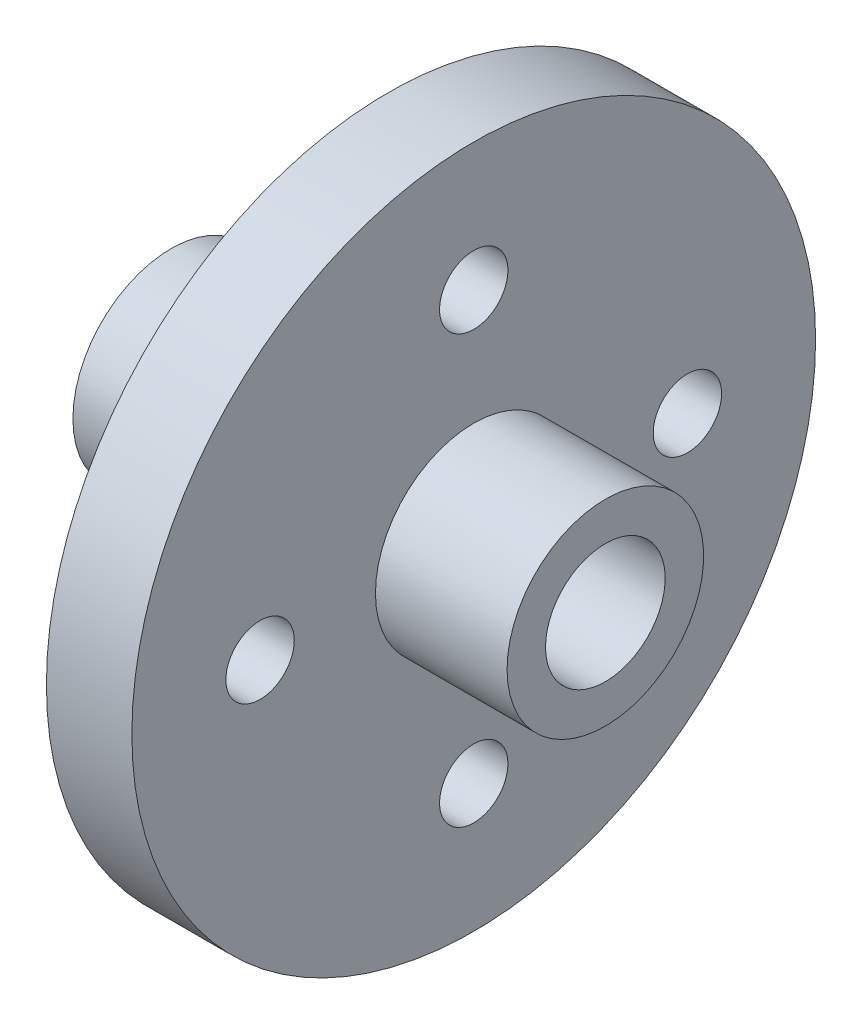
ISO-10303-21;
HEADER;
FILE_DESCRIPTION(('STEP AP214'),'2;1');
FILE_NAME('part.step','',(''),(''),'','','');
FILE_SCHEMA(('AUTOMOTIVE_DESIGN { 1 0 10303 214 1 1 1 1 }'));
ENDSEC;
DATA;
#1=APPLICATION_CONTEXT('core data for automotive mechanical design processes');
#2=APPLICATION_PROTOCOL_DEFINITION('international standard','automotive_design',2000,#1);
#3=PRODUCT_CONTEXT('',#1,'mechanical');
#4=PRODUCT('Part','Part','',(#3));
#5=PRODUCT_RELATED_PRODUCT_CATEGORY('part','',(#4));
#6=PRODUCT_DEFINITION_FORMATION('','',#4);
#7=PRODUCT_DEFINITION_CONTEXT('part definition',#1,'design');
#8=PRODUCT_DEFINITION('design','',#6,#7);
#9=PRODUCT_DEFINITION_SHAPE('','',#8);
#10=(LENGTH_UNIT() NAMED_UNIT(*) SI_UNIT(.MILLI.,.METRE.));
#11=(NAMED_UNIT(*) PLANE_ANGLE_UNIT() SI_UNIT($,.RADIAN.));
#12=(NAMED_UNIT(*) SI_UNIT($,.STERADIAN.) SOLID_ANGLE_UNIT());
#13=UNCERTAINTY_MEASURE_WITH_UNIT(LENGTH_MEASURE(1.E-05),#10,'distance_accuracy_value','');
#14=(GEOMETRIC_REPRESENTATION_CONTEXT(3) GLOBAL_UNCERTAINTY_ASSIGNED_CONTEXT((#13)) GLOBAL_UNIT_ASSIGNED_CONTEXT((#10,
#11,#12)) REPRESENTATION_CONTEXT('',''));
#15=CARTESIAN_POINT('',(0.,0.,0.));
#16=DIRECTION('',(0.,0.,1.));
#17=DIRECTION('',(1.,0.,0.));
#18=AXIS2_PLACEMENT_3D('',#15,#16,#17);
#19=CARTESIAN_POINT('',(5.,0.,0.));
#20=DIRECTION('',(1.,0.,0.));
#21=DIRECTION('',(0.,0.,-1.));
#22=AXIS2_PLACEMENT_3D('',#19,#20,#21);
#23=PLANE('',#22);
#24=CARTESIAN_POINT('',(5.,0.,-12.5));
#25=DIRECTION('',(1.,0.,0.));
#26=DIRECTION('',(0.,0.,-1.));
#27=AXIS2_PLACEMENT_3D('',#24,#25,#26);
#28=CIRCLE('',#27,2.);
#29=CARTESIAN_POINT('',(5.,0.,-14.5));
#30=VERTEX_POINT('',#29);
#31=EDGE_CURVE('E89',#30,#30,#28,.T.);
#32=ORIENTED_EDGE('',*,*,#31,.F.);
#33=EDGE_LOOP('',(#32));
#34=FACE_BOUND('',#33,.T.);
#35=CARTESIAN_POINT('',(5.,-12.5,0.));
#36=DIRECTION('',(1.,0.,0.));
#37=DIRECTION('',(0.,0.,-1.));
#38=AXIS2_PLACEMENT_3D('',#35,#36,#37);
#39=CIRCLE('',#38,2.);
#40=CARTESIAN_POINT('',(5.,-12.5,-2.));
#41=VERTEX_POINT('',#40);
#42=EDGE_CURVE('E83',#41,#41,#39,.T.);
#43=ORIENTED_EDGE('',*,*,#42,.F.);
#44=EDGE_LOOP('',(#43));
#45=FACE_BOUND('',#44,.T.);
#46=CARTESIAN_POINT('',(5.,0.,12.5));
#47=DIRECTION('',(1.,0.,0.));
#48=DIRECTION('',(0.,0.,-1.));
#49=AXIS2_PLACEMENT_3D('',#46,#47,#48);
#50=CIRCLE('',#49,2.);
#51=CARTESIAN_POINT('',(5.,0.,10.5));
#52=VERTEX_POINT('',#51);
#53=EDGE_CURVE('E77',#52,#52,#50,.T.);
#54=ORIENTED_EDGE('',*,*,#53,.F.);
#55=EDGE_LOOP('',(#54));
#56=FACE_BOUND('',#55,.T.);
#57=CARTESIAN_POINT('',(5.,12.5,0.));
#58=DIRECTION('',(1.,0.,0.));
#59=DIRECTION('',(0.,0.,-1.));
#60=AXIS2_PLACEMENT_3D('',#57,#58,#59);
#61=CIRCLE('',#60,2.);
#62=CARTESIAN_POINT('',(5.,12.5,-2.));
#63=VERTEX_POINT('',#62);
#64=EDGE_CURVE('E71',#63,#63,#61,.T.);
#65=ORIENTED_EDGE('',*,*,#64,.F.);
#66=EDGE_LOOP('',(#65));
#67=FACE_BOUND('',#66,.T.);
#68=CARTESIAN_POINT('',(5.,0.,0.));
#69=DIRECTION('',(1.,0.,0.));
#70=DIRECTION('',(0.,0.,-1.));
#71=AXIS2_PLACEMENT_3D('',#68,#69,#70);
#72=CIRCLE('',#71,5.75);
#73=CARTESIAN_POINT('',(5.,0.,-5.75));
#74=VERTEX_POINT('',#73);
#75=EDGE_CURVE('E10',#74,#74,#72,.T.);
#76=ORIENTED_EDGE('',*,*,#75,.F.);
#77=EDGE_LOOP('',(#76));
#78=FACE_BOUND('',#77,.T.);
#79=CARTESIAN_POINT('',(5.,0.,0.));
#80=DIRECTION('',(1.,0.,0.));
#81=DIRECTION('',(0.,0.,-1.));
#82=AXIS2_PLACEMENT_3D('',#79,#80,#81);
#83=CIRCLE('',#82,20.);
#84=CARTESIAN_POINT('',(5.,0.,-20.));
#85=VERTEX_POINT('',#84);
#86=EDGE_CURVE('E38',#85,#85,#83,.T.);
#87=ORIENTED_EDGE('',*,*,#86,.T.);
#88=EDGE_LOOP('',(#87));
#89=FACE_BOUND('',#88,.T.);
#90=ADVANCED_FACE('F30',(#34,#45,#56,#67,#78,#89),#23,.T.);
#91=CARTESIAN_POINT('',(0.,0.,0.));
#92=DIRECTION('',(1.,0.,0.));
#93=DIRECTION('',(0.,0.,-1.));
#94=AXIS2_PLACEMENT_3D('',#91,#92,#93);
#95=PLANE('',#94);
#96=CARTESIAN_POINT('',(0.,0.,-12.5));
#97=DIRECTION('',(1.,0.,0.));
#98=DIRECTION('',(0.,0.,-1.));
#99=AXIS2_PLACEMENT_3D('',#96,#97,#98);
#100=CIRCLE('',#99,2.);
#101=CARTESIAN_POINT('',(0.,0.,-14.5));
#102=VERTEX_POINT('',#101);
#103=EDGE_CURVE('E86',#102,#102,#100,.T.);
#104=ORIENTED_EDGE('',*,*,#103,.T.);
#105=EDGE_LOOP('',(#104));
#106=FACE_BOUND('',#105,.T.);
#107=CARTESIAN_POINT('',(0.,-12.5,0.));
#108=DIRECTION('',(1.,0.,0.));
#109=DIRECTION('',(0.,0.,-1.));
#110=AXIS2_PLACEMENT_3D('',#107,#108,#109);
#111=CIRCLE('',#110,2.);
#112=CARTESIAN_POINT('',(0.,-12.5,-2.));
#113=VERTEX_POINT('',#112);
#114=EDGE_CURVE('E80',#113,#113,#111,.T.);
#115=ORIENTED_EDGE('',*,*,#114,.T.);
#116=EDGE_LOOP('',(#115));
#117=FACE_BOUND('',#116,.T.);
#118=CARTESIAN_POINT('',(0.,0.,12.5));
#119=DIRECTION('',(1.,0.,0.));
#120=DIRECTION('',(0.,0.,-1.));
#121=AXIS2_PLACEMENT_3D('',#118,#119,#120);
#122=CIRCLE('',#121,2.);
#123=CARTESIAN_POINT('',(0.,0.,10.5));
#124=VERTEX_POINT('',#123);
#125=EDGE_CURVE('E74',#124,#124,#122,.T.);
#126=ORIENTED_EDGE('',*,*,#125,.T.);
#127=EDGE_LOOP('',(#126));
#128=FACE_BOUND('',#127,.T.);
#129=CARTESIAN_POINT('',(0.,12.5,0.));
#130=DIRECTION('',(1.,0.,0.));
#131=DIRECTION('',(0.,0.,-1.));
#132=AXIS2_PLACEMENT_3D('',#129,#130,#131);
#133=CIRCLE('',#132,2.);
#134=CARTESIAN_POINT('',(0.,12.5,-2.));
#135=VERTEX_POINT('',#134);
#136=EDGE_CURVE('E68',#135,#135,#133,.T.);
#137=ORIENTED_EDGE('',*,*,#136,.T.);
#138=EDGE_LOOP('',(#137));
#139=FACE_BOUND('',#138,.T.);
#140=CARTESIAN_POINT('',(0.,0.,0.));
#141=DIRECTION('',(1.,0.,0.));
#142=DIRECTION('',(0.,0.,-1.));
#143=AXIS2_PLACEMENT_3D('',#140,#141,#142);
#144=CIRCLE('',#143,5.75);
#145=CARTESIAN_POINT('',(0.,0.,-5.75));
#146=VERTEX_POINT('',#145);
#147=EDGE_CURVE('E34',#146,#146,#144,.T.);
#148=ORIENTED_EDGE('',*,*,#147,.T.);
#149=EDGE_LOOP('',(#148));
#150=FACE_BOUND('',#149,.T.);
#151=CARTESIAN_POINT('',(0.,0.,0.));
#152=DIRECTION('',(1.,0.,0.));
#153=DIRECTION('',(0.,0.,-1.));
#154=AXIS2_PLACEMENT_3D('',#151,#152,#153);
#155=CIRCLE('',#154,20.);
#156=CARTESIAN_POINT('',(0.,0.,-20.));
#157=VERTEX_POINT('',#156);
#158=EDGE_CURVE('E43',#157,#157,#155,.T.);
#159=ORIENTED_EDGE('',*,*,#158,.F.);
#160=EDGE_LOOP('',(#159));
#161=FACE_BOUND('',#160,.T.);
#162=ADVANCED_FACE('F98',(#106,#117,#128,#139,#150,#161),#95,.F.);
#163=CARTESIAN_POINT('',(5.,0.,0.));
#164=DIRECTION('',(-1.,0.,0.));
#165=DIRECTION('',(0.,0.,1.));
#166=AXIS2_PLACEMENT_3D('',#163,#164,#165);
#167=CYLINDRICAL_SURFACE('',#166,20.);
#168=ORIENTED_EDGE('',*,*,#86,.F.);
#169=EDGE_LOOP('',(#168));
#170=FACE_BOUND('',#169,.T.);
#171=ORIENTED_EDGE('',*,*,#158,.T.);
#172=EDGE_LOOP('',(#171));
#173=FACE_BOUND('',#172,.T.);
#174=ADVANCED_FACE('F32',(#170,#173),#167,.T.);
#175=CARTESIAN_POINT('',(12.7,0.,0.));
#176=DIRECTION('',(-1.,0.,0.));
#177=DIRECTION('',(0.,0.,1.));
#178=AXIS2_PLACEMENT_3D('',#175,#176,#177);
#179=CYLINDRICAL_SURFACE('',#178,5.75);
#180=CARTESIAN_POINT('',(-12.7,0.,0.));
#181=DIRECTION('',(-1.,0.,0.));
#182=DIRECTION('',(0.,0.,1.));
#183=AXIS2_PLACEMENT_3D('',#180,#181,#182);
#184=CIRCLE('',#183,5.75);
#185=CARTESIAN_POINT('',(-12.7,0.,5.75));
#186=VERTEX_POINT('',#185);
#187=EDGE_CURVE('E59',#186,#186,#184,.T.);
#188=ORIENTED_EDGE('',*,*,#187,.F.);
#189=EDGE_LOOP('',(#188));
#190=FACE_BOUND('',#189,.T.);
#191=ORIENTED_EDGE('',*,*,#147,.F.);
#192=EDGE_LOOP('',(#191));
#193=FACE_BOUND('',#192,.T.);
#194=ADVANCED_FACE('F110',(#190,#193),#179,.T.);
#195=CARTESIAN_POINT('',(-12.7,0.,0.));
#196=DIRECTION('',(-1.,0.,0.));
#197=DIRECTION('',(0.,0.,1.));
#198=AXIS2_PLACEMENT_3D('',#195,#196,#197);
#199=PLANE('',#198);
#200=ORIENTED_EDGE('',*,*,#187,.T.);
#201=EDGE_LOOP('',(#200));
#202=FACE_BOUND('',#201,.T.);
#203=CARTESIAN_POINT('',(-12.7,0.,0.));
#204=DIRECTION('',(-1.,0.,0.));
#205=DIRECTION('',(0.,0.,1.));
#206=AXIS2_PLACEMENT_3D('',#203,#204,#205);
#207=CIRCLE('',#206,3.5);
#208=CARTESIAN_POINT('',(-12.7,0.,3.5));
#209=VERTEX_POINT('',#208);
#210=EDGE_CURVE('E63',#209,#209,#207,.T.);
#211=ORIENTED_EDGE('',*,*,#210,.F.);
#212=EDGE_LOOP('',(#211));
#213=FACE_BOUND('',#212,.T.);
#214=ADVANCED_FACE('F115',(#202,#213),#199,.T.);
#215=CARTESIAN_POINT('',(5.,0.,0.));
#216=DIRECTION('',(-1.,0.,0.));
#217=DIRECTION('',(0.,0.,1.));
#218=AXIS2_PLACEMENT_3D('',#215,#216,#217);
#219=CYLINDRICAL_SURFACE('',#218,3.5);
#220=ORIENTED_EDGE('',*,*,#210,.T.);
#221=EDGE_LOOP('',(#220));
#222=FACE_BOUND('',#221,.T.);
#223=CARTESIAN_POINT('',(12.7,0.,0.));
#224=DIRECTION('',(-1.,0.,0.));
#225=DIRECTION('',(0.,0.,1.));
#226=AXIS2_PLACEMENT_3D('',#223,#224,#225);
#227=CIRCLE('',#226,3.5);
#228=CARTESIAN_POINT('',(12.7,0.,3.5));
#229=VERTEX_POINT('',#228);
#230=EDGE_CURVE('E55',#229,#229,#227,.T.);
#231=ORIENTED_EDGE('',*,*,#230,.F.);
#232=EDGE_LOOP('',(#231));
#233=FACE_BOUND('',#232,.T.);
#234=ADVANCED_FACE('F124',(#222,#233),#219,.F.);
#235=ORIENTED_EDGE('',*,*,#75,.T.);
#236=EDGE_LOOP('',(#235));
#237=FACE_BOUND('',#236,.T.);
#238=CARTESIAN_POINT('',(12.7,0.,0.));
#239=DIRECTION('',(-1.,0.,0.));
#240=DIRECTION('',(0.,0.,1.));
#241=AXIS2_PLACEMENT_3D('',#238,#239,#240);
#242=CIRCLE('',#241,5.75);
#243=CARTESIAN_POINT('',(12.7,0.,5.75));
#244=VERTEX_POINT('',#243);
#245=EDGE_CURVE('E46',#244,#244,#242,.T.);
#246=ORIENTED_EDGE('',*,*,#245,.T.);
#247=EDGE_LOOP('',(#246));
#248=FACE_BOUND('',#247,.T.);
#249=ADVANCED_FACE('F118',(#237,#248),#179,.T.);
#250=CARTESIAN_POINT('',(12.7,0.,0.));
#251=DIRECTION('',(-1.,0.,0.));
#252=DIRECTION('',(0.,0.,1.));
#253=AXIS2_PLACEMENT_3D('',#250,#251,#252);
#254=PLANE('',#253);
#255=ORIENTED_EDGE('',*,*,#230,.T.);
#256=EDGE_LOOP('',(#255));
#257=FACE_BOUND('',#256,.T.);
#258=ORIENTED_EDGE('',*,*,#245,.F.);
#259=EDGE_LOOP('',(#258));
#260=FACE_BOUND('',#259,.T.);
#261=ADVANCED_FACE('F129',(#257,#260),#254,.F.);
#262=CARTESIAN_POINT('',(5.,12.5,0.));
#263=DIRECTION('',(1.,0.,0.));
#264=DIRECTION('',(0.,0.,-1.));
#265=AXIS2_PLACEMENT_3D('',#262,#263,#264);
#266=CYLINDRICAL_SURFACE('',#265,2.);
#267=ORIENTED_EDGE('',*,*,#64,.T.);
#268=EDGE_LOOP('',(#267));
#269=FACE_BOUND('',#268,.T.);
#270=ORIENTED_EDGE('',*,*,#136,.F.);
#271=EDGE_LOOP('',(#270));
#272=FACE_BOUND('',#271,.T.);
#273=ADVANCED_FACE('F132',(#269,#272),#266,.F.);
#274=CARTESIAN_POINT('',(5.,0.,12.5));
#275=DIRECTION('',(1.,0.,0.));
#276=DIRECTION('',(0.,0.,-1.));
#277=AXIS2_PLACEMENT_3D('',#274,#275,#276);
#278=CYLINDRICAL_SURFACE('',#277,2.);
#279=ORIENTED_EDGE('',*,*,#53,.T.);
#280=EDGE_LOOP('',(#279));
#281=FACE_BOUND('',#280,.T.);
#282=ORIENTED_EDGE('',*,*,#125,.F.);
#283=EDGE_LOOP('',(#282));
#284=FACE_BOUND('',#283,.T.);
#285=ADVANCED_FACE('F138',(#281,#284),#278,.F.);
#286=CARTESIAN_POINT('',(5.,-12.5,0.));
#287=DIRECTION('',(1.,0.,0.));
#288=DIRECTION('',(0.,0.,-1.));
#289=AXIS2_PLACEMENT_3D('',#286,#287,#288);
#290=CYLINDRICAL_SURFACE('',#289,2.);
#291=ORIENTED_EDGE('',*,*,#42,.T.);
#292=EDGE_LOOP('',(#291));
#293=FACE_BOUND('',#292,.T.);
#294=ORIENTED_EDGE('',*,*,#114,.F.);
#295=EDGE_LOOP('',(#294));
#296=FACE_BOUND('',#295,.T.);
#297=ADVANCED_FACE('F142',(#293,#296),#290,.F.);
#298=CARTESIAN_POINT('',(5.,0.,-12.5));
#299=DIRECTION('',(1.,0.,0.));
#300=DIRECTION('',(0.,0.,-1.));
#301=AXIS2_PLACEMENT_3D('',#298,#299,#300);
#302=CYLINDRICAL_SURFACE('',#301,2.);
#303=ORIENTED_EDGE('',*,*,#31,.T.);
#304=EDGE_LOOP('',(#303));
#305=FACE_BOUND('',#304,.T.);
#306=ORIENTED_EDGE('',*,*,#103,.F.);
#307=EDGE_LOOP('',(#306));
#308=FACE_BOUND('',#307,.T.);
#309=ADVANCED_FACE('F93',(#305,#308),#302,.F.);
#310=CLOSED_SHELL('',(#90,#162,#174,#194,#214,#234,#249,#261,#273,#285,#297,#309));
#311=MANIFOLD_SOLID_BREP('B2',#310);
#312=ADVANCED_BREP_SHAPE_REPRESENTATION('',(#18,#311),#14);
#313=SHAPE_DEFINITION_REPRESENTATION(#9,#312);
ENDSEC;
END-ISO-10303-21;
